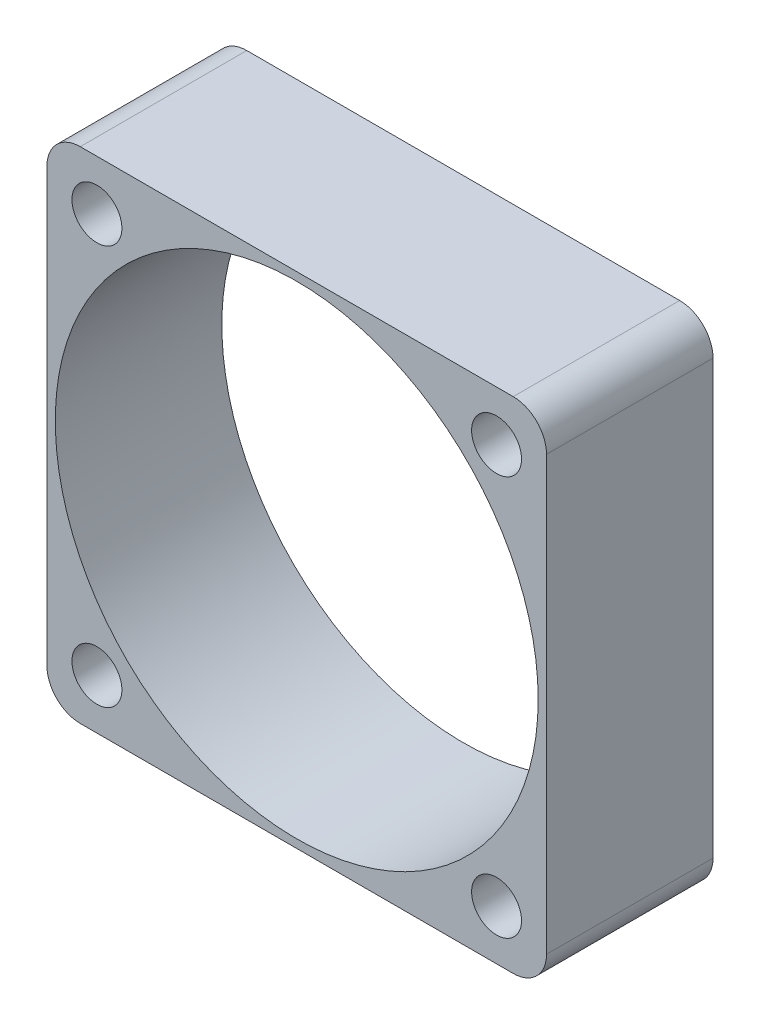
ISO-10303-21;
HEADER;
FILE_DESCRIPTION(('STEP AP214'),'2;1');
FILE_NAME('part.step','',(''),(''),'','','');
FILE_SCHEMA(('AUTOMOTIVE_DESIGN { 1 0 10303 214 1 1 1 1 }'));
ENDSEC;
DATA;
#1=APPLICATION_CONTEXT('core data for automotive mechanical design processes');
#2=APPLICATION_PROTOCOL_DEFINITION('international standard','automotive_design',2000,#1);
#3=PRODUCT_CONTEXT('',#1,'mechanical');
#4=PRODUCT('Part','Part','',(#3));
#5=PRODUCT_RELATED_PRODUCT_CATEGORY('part','',(#4));
#6=PRODUCT_DEFINITION_FORMATION('','',#4);
#7=PRODUCT_DEFINITION_CONTEXT('part definition',#1,'design');
#8=PRODUCT_DEFINITION('design','',#6,#7);
#9=PRODUCT_DEFINITION_SHAPE('','',#8);
#10=(LENGTH_UNIT() NAMED_UNIT(*) SI_UNIT(.MILLI.,.METRE.));
#11=(NAMED_UNIT(*) PLANE_ANGLE_UNIT() SI_UNIT($,.RADIAN.));
#12=(NAMED_UNIT(*) SI_UNIT($,.STERADIAN.) SOLID_ANGLE_UNIT());
#13=UNCERTAINTY_MEASURE_WITH_UNIT(LENGTH_MEASURE(1.E-05),#10,'distance_accuracy_value','');
#14=(GEOMETRIC_REPRESENTATION_CONTEXT(3) GLOBAL_UNCERTAINTY_ASSIGNED_CONTEXT((#13)) GLOBAL_UNIT_ASSIGNED_CONTEXT((#10,
#11,#12)) REPRESENTATION_CONTEXT('',''));
#15=CARTESIAN_POINT('',(0.,0.,0.));
#16=DIRECTION('',(0.,0.,1.));
#17=DIRECTION('',(1.,0.,0.));
#18=AXIS2_PLACEMENT_3D('',#15,#16,#17);
#19=CARTESIAN_POINT('',(0.,0.,10.));
#20=DIRECTION('',(0.,0.,1.));
#21=DIRECTION('',(1.,0.,0.));
#22=AXIS2_PLACEMENT_3D('',#19,#20,#21);
#23=PLANE('',#22);
#24=CARTESIAN_POINT('',(12.,12.,10.));
#25=DIRECTION('',(0.,0.,1.));
#26=DIRECTION('',(-1.,0.,0.));
#27=AXIS2_PLACEMENT_3D('',#24,#25,#26);
#28=CIRCLE('',#27,1.5);
#29=CARTESIAN_POINT('',(10.5,12.,10.));
#30=VERTEX_POINT('',#29);
#31=EDGE_CURVE('E200',#30,#30,#28,.T.);
#32=ORIENTED_EDGE('',*,*,#31,.F.);
#33=EDGE_LOOP('',(#32));
#34=FACE_BOUND('',#33,.T.);
#35=CARTESIAN_POINT('',(12.,-12.,10.));
#36=DIRECTION('',(0.,0.,1.));
#37=DIRECTION('',(1.,0.,0.));
#38=AXIS2_PLACEMENT_3D('',#35,#36,#37);
#39=CIRCLE('',#38,1.5);
#40=CARTESIAN_POINT('',(13.5,-12.,10.));
#41=VERTEX_POINT('',#40);
#42=EDGE_CURVE('E194',#41,#41,#39,.T.);
#43=ORIENTED_EDGE('',*,*,#42,.F.);
#44=EDGE_LOOP('',(#43));
#45=FACE_BOUND('',#44,.T.);
#46=CARTESIAN_POINT('',(-12.,-12.,10.));
#47=DIRECTION('',(0.,0.,1.));
#48=DIRECTION('',(-1.,0.,0.));
#49=AXIS2_PLACEMENT_3D('',#46,#47,#48);
#50=CIRCLE('',#49,1.5);
#51=CARTESIAN_POINT('',(-13.5,-12.,10.));
#52=VERTEX_POINT('',#51);
#53=EDGE_CURVE('E188',#52,#52,#50,.T.);
#54=ORIENTED_EDGE('',*,*,#53,.F.);
#55=EDGE_LOOP('',(#54));
#56=FACE_BOUND('',#55,.T.);
#57=CARTESIAN_POINT('',(-12.,12.,10.));
#58=DIRECTION('',(0.,0.,1.));
#59=DIRECTION('',(1.,0.,0.));
#60=AXIS2_PLACEMENT_3D('',#57,#58,#59);
#61=CIRCLE('',#60,1.5);
#62=CARTESIAN_POINT('',(-10.5,12.,10.));
#63=VERTEX_POINT('',#62);
#64=EDGE_CURVE('E182',#63,#63,#61,.T.);
#65=ORIENTED_EDGE('',*,*,#64,.F.);
#66=EDGE_LOOP('',(#65));
#67=FACE_BOUND('',#66,.T.);
#68=DIRECTION('',(0.,-1.,0.));
#69=VECTOR('',#68,1.);
#70=CARTESIAN_POINT('',(-15.,15.,10.));
#71=LINE('',#70,#69);
#72=CARTESIAN_POINT('',(-15.,13.,10.));
#73=VERTEX_POINT('',#72);
#74=CARTESIAN_POINT('',(-15.,-13.,10.));
#75=VERTEX_POINT('',#74);
#76=EDGE_CURVE('E136',#73,#75,#71,.T.);
#77=ORIENTED_EDGE('',*,*,#76,.T.);
#78=CARTESIAN_POINT('',(-13.,-13.,10.));
#79=DIRECTION('',(0.,0.,1.));
#80=DIRECTION('',(1.,0.,0.));
#81=AXIS2_PLACEMENT_3D('',#78,#79,#80);
#82=CIRCLE('',#81,2.);
#83=CARTESIAN_POINT('',(-13.,-15.,10.));
#84=VERTEX_POINT('',#83);
#85=EDGE_CURVE('E151',#75,#84,#82,.T.);
#86=ORIENTED_EDGE('',*,*,#85,.T.);
#87=DIRECTION('',(1.,0.,0.));
#88=VECTOR('',#87,1.);
#89=CARTESIAN_POINT('',(-15.,-15.,10.));
#90=LINE('',#89,#88);
#91=CARTESIAN_POINT('',(13.,-15.,10.));
#92=VERTEX_POINT('',#91);
#93=EDGE_CURVE('E118',#84,#92,#90,.T.);
#94=ORIENTED_EDGE('',*,*,#93,.T.);
#95=CARTESIAN_POINT('',(13.,-13.,10.));
#96=DIRECTION('',(0.,0.,1.));
#97=DIRECTION('',(1.,0.,0.));
#98=AXIS2_PLACEMENT_3D('',#95,#96,#97);
#99=CIRCLE('',#98,2.);
#100=CARTESIAN_POINT('',(15.,-13.,10.));
#101=VERTEX_POINT('',#100);
#102=EDGE_CURVE('E149',#92,#101,#99,.T.);
#103=ORIENTED_EDGE('',*,*,#102,.T.);
#104=DIRECTION('',(0.,1.,0.));
#105=VECTOR('',#104,1.);
#106=CARTESIAN_POINT('',(15.,15.,10.));
#107=LINE('',#106,#105);
#108=CARTESIAN_POINT('',(15.,13.,10.));
#109=VERTEX_POINT('',#108);
#110=EDGE_CURVE('E162',#101,#109,#107,.T.);
#111=ORIENTED_EDGE('',*,*,#110,.T.);
#112=CARTESIAN_POINT('',(13.,13.,10.));
#113=DIRECTION('',(0.,0.,1.));
#114=DIRECTION('',(1.,0.,0.));
#115=AXIS2_PLACEMENT_3D('',#112,#113,#114);
#116=CIRCLE('',#115,2.);
#117=CARTESIAN_POINT('',(13.,15.,10.));
#118=VERTEX_POINT('',#117);
#119=EDGE_CURVE('E53',#109,#118,#116,.T.);
#120=ORIENTED_EDGE('',*,*,#119,.T.);
#121=DIRECTION('',(-1.,0.,0.));
#122=VECTOR('',#121,1.);
#123=CARTESIAN_POINT('',(-15.,15.,10.));
#124=LINE('',#123,#122);
#125=CARTESIAN_POINT('',(-13.,15.,10.));
#126=VERTEX_POINT('',#125);
#127=EDGE_CURVE('E137',#118,#126,#124,.T.);
#128=ORIENTED_EDGE('',*,*,#127,.T.);
#129=CARTESIAN_POINT('',(-13.,13.,10.));
#130=DIRECTION('',(0.,0.,1.));
#131=DIRECTION('',(1.,0.,0.));
#132=AXIS2_PLACEMENT_3D('',#129,#130,#131);
#133=CIRCLE('',#132,2.);
#134=EDGE_CURVE('E146',#126,#73,#133,.T.);
#135=ORIENTED_EDGE('',*,*,#134,.T.);
#136=EDGE_LOOP('',(#77,#86,#94,#103,#111,#120,#128,#135));
#137=FACE_BOUND('',#136,.T.);
#138=CARTESIAN_POINT('',(0.,0.,10.));
#139=DIRECTION('',(0.,0.,1.));
#140=DIRECTION('',(1.,0.,0.));
#141=AXIS2_PLACEMENT_3D('',#138,#139,#140);
#142=CIRCLE('',#141,14.5);
#143=CARTESIAN_POINT('',(14.5,0.,10.));
#144=VERTEX_POINT('',#143);
#145=EDGE_CURVE('E131',#144,#144,#142,.T.);
#146=ORIENTED_EDGE('',*,*,#145,.F.);
#147=EDGE_LOOP('',(#146));
#148=FACE_BOUND('',#147,.T.);
#149=ADVANCED_FACE('F32',(#34,#45,#56,#67,#137,#148),#23,.T.);
#150=CARTESIAN_POINT('',(0.,0.,0.));
#151=DIRECTION('',(0.,0.,1.));
#152=DIRECTION('',(1.,0.,0.));
#153=AXIS2_PLACEMENT_3D('',#150,#151,#152);
#154=PLANE('',#153);
#155=CARTESIAN_POINT('',(12.,12.,0.));
#156=DIRECTION('',(0.,0.,1.));
#157=DIRECTION('',(-1.,0.,0.));
#158=AXIS2_PLACEMENT_3D('',#155,#156,#157);
#159=CIRCLE('',#158,1.5);
#160=CARTESIAN_POINT('',(10.5,12.,0.));
#161=VERTEX_POINT('',#160);
#162=EDGE_CURVE('E185',#161,#161,#159,.T.);
#163=ORIENTED_EDGE('',*,*,#162,.T.);
#164=EDGE_LOOP('',(#163));
#165=FACE_BOUND('',#164,.T.);
#166=CARTESIAN_POINT('',(12.,-12.,0.));
#167=DIRECTION('',(0.,0.,1.));
#168=DIRECTION('',(1.,0.,0.));
#169=AXIS2_PLACEMENT_3D('',#166,#167,#168);
#170=CIRCLE('',#169,1.5);
#171=CARTESIAN_POINT('',(13.5,-12.,0.));
#172=VERTEX_POINT('',#171);
#173=EDGE_CURVE('E197',#172,#172,#170,.T.);
#174=ORIENTED_EDGE('',*,*,#173,.T.);
#175=EDGE_LOOP('',(#174));
#176=FACE_BOUND('',#175,.T.);
#177=CARTESIAN_POINT('',(-12.,-12.,0.));
#178=DIRECTION('',(0.,0.,1.));
#179=DIRECTION('',(-1.,0.,0.));
#180=AXIS2_PLACEMENT_3D('',#177,#178,#179);
#181=CIRCLE('',#180,1.5);
#182=CARTESIAN_POINT('',(-13.5,-12.,0.));
#183=VERTEX_POINT('',#182);
#184=EDGE_CURVE('E191',#183,#183,#181,.T.);
#185=ORIENTED_EDGE('',*,*,#184,.T.);
#186=EDGE_LOOP('',(#185));
#187=FACE_BOUND('',#186,.T.);
#188=CARTESIAN_POINT('',(-12.,12.,0.));
#189=DIRECTION('',(0.,0.,1.));
#190=DIRECTION('',(1.,0.,0.));
#191=AXIS2_PLACEMENT_3D('',#188,#189,#190);
#192=CIRCLE('',#191,1.5);
#193=CARTESIAN_POINT('',(-10.5,12.,0.));
#194=VERTEX_POINT('',#193);
#195=EDGE_CURVE('E179',#194,#194,#192,.T.);
#196=ORIENTED_EDGE('',*,*,#195,.T.);
#197=EDGE_LOOP('',(#196));
#198=FACE_BOUND('',#197,.T.);
#199=DIRECTION('',(1.,0.,0.));
#200=VECTOR('',#199,1.);
#201=CARTESIAN_POINT('',(-15.,-15.,0.));
#202=LINE('',#201,#200);
#203=CARTESIAN_POINT('',(-13.,-15.,0.));
#204=VERTEX_POINT('',#203);
#205=CARTESIAN_POINT('',(13.,-15.,0.));
#206=VERTEX_POINT('',#205);
#207=EDGE_CURVE('E115',#204,#206,#202,.T.);
#208=ORIENTED_EDGE('',*,*,#207,.F.);
#209=CARTESIAN_POINT('',(-13.,-13.,0.));
#210=DIRECTION('',(0.,0.,1.));
#211=DIRECTION('',(1.,0.,0.));
#212=AXIS2_PLACEMENT_3D('',#209,#210,#211);
#213=CIRCLE('',#212,2.);
#214=CARTESIAN_POINT('',(-15.,-13.,0.));
#215=VERTEX_POINT('',#214);
#216=EDGE_CURVE('E98',#204,#215,#213,.F.);
#217=ORIENTED_EDGE('',*,*,#216,.T.);
#218=DIRECTION('',(0.,-1.,0.));
#219=VECTOR('',#218,1.);
#220=CARTESIAN_POINT('',(-15.,15.,0.));
#221=LINE('',#220,#219);
#222=CARTESIAN_POINT('',(-15.,13.,0.));
#223=VERTEX_POINT('',#222);
#224=EDGE_CURVE('E126',#223,#215,#221,.T.);
#225=ORIENTED_EDGE('',*,*,#224,.F.);
#226=CARTESIAN_POINT('',(-13.,13.,0.));
#227=DIRECTION('',(0.,0.,1.));
#228=DIRECTION('',(1.,0.,0.));
#229=AXIS2_PLACEMENT_3D('',#226,#227,#228);
#230=CIRCLE('',#229,2.);
#231=CARTESIAN_POINT('',(-13.,15.,0.));
#232=VERTEX_POINT('',#231);
#233=EDGE_CURVE('E119',#223,#232,#230,.F.);
#234=ORIENTED_EDGE('',*,*,#233,.T.);
#235=DIRECTION('',(-1.,0.,0.));
#236=VECTOR('',#235,1.);
#237=CARTESIAN_POINT('',(-15.,15.,0.));
#238=LINE('',#237,#236);
#239=CARTESIAN_POINT('',(13.,15.,0.));
#240=VERTEX_POINT('',#239);
#241=EDGE_CURVE('E129',#240,#232,#238,.T.);
#242=ORIENTED_EDGE('',*,*,#241,.F.);
#243=CARTESIAN_POINT('',(13.,13.,0.));
#244=DIRECTION('',(0.,0.,1.));
#245=DIRECTION('',(1.,0.,0.));
#246=AXIS2_PLACEMENT_3D('',#243,#244,#245);
#247=CIRCLE('',#246,2.);
#248=CARTESIAN_POINT('',(15.,13.,0.));
#249=VERTEX_POINT('',#248);
#250=EDGE_CURVE('E140',#240,#249,#247,.F.);
#251=ORIENTED_EDGE('',*,*,#250,.T.);
#252=DIRECTION('',(0.,1.,0.));
#253=VECTOR('',#252,1.);
#254=CARTESIAN_POINT('',(15.,15.,0.));
#255=LINE('',#254,#253);
#256=CARTESIAN_POINT('',(15.,-13.,0.));
#257=VERTEX_POINT('',#256);
#258=EDGE_CURVE('E125',#257,#249,#255,.T.);
#259=ORIENTED_EDGE('',*,*,#258,.F.);
#260=CARTESIAN_POINT('',(13.,-13.,0.));
#261=DIRECTION('',(0.,0.,1.));
#262=DIRECTION('',(1.,0.,0.));
#263=AXIS2_PLACEMENT_3D('',#260,#261,#262);
#264=CIRCLE('',#263,2.);
#265=EDGE_CURVE('E109',#257,#206,#264,.F.);
#266=ORIENTED_EDGE('',*,*,#265,.T.);
#267=EDGE_LOOP('',(#208,#217,#225,#234,#242,#251,#259,#266));
#268=FACE_BOUND('',#267,.T.);
#269=CARTESIAN_POINT('',(0.,0.,0.));
#270=DIRECTION('',(0.,0.,1.));
#271=DIRECTION('',(1.,0.,0.));
#272=AXIS2_PLACEMENT_3D('',#269,#270,#271);
#273=CIRCLE('',#272,14.5);
#274=CARTESIAN_POINT('',(14.5,0.,0.));
#275=VERTEX_POINT('',#274);
#276=EDGE_CURVE('E176',#275,#275,#273,.T.);
#277=ORIENTED_EDGE('',*,*,#276,.T.);
#278=EDGE_LOOP('',(#277));
#279=FACE_BOUND('',#278,.T.);
#280=ADVANCED_FACE('F122',(#165,#176,#187,#198,#268,#279),#154,.F.);
#281=CARTESIAN_POINT('',(-15.,15.,10.));
#282=DIRECTION('',(1.,0.,0.));
#283=DIRECTION('',(0.,1.,0.));
#284=AXIS2_PLACEMENT_3D('',#281,#282,#283);
#285=PLANE('',#284);
#286=ORIENTED_EDGE('',*,*,#224,.T.);
#287=DIRECTION('',(0.,0.,-1.));
#288=VECTOR('',#287,1.);
#289=CARTESIAN_POINT('',(-15.,-13.,10.));
#290=LINE('',#289,#288);
#291=EDGE_CURVE('E103',#215,#75,#290,.F.);
#292=ORIENTED_EDGE('',*,*,#291,.T.);
#293=ORIENTED_EDGE('',*,*,#76,.F.);
#294=DIRECTION('',(0.,0.,-1.));
#295=VECTOR('',#294,1.);
#296=CARTESIAN_POINT('',(-15.,13.,10.));
#297=LINE('',#296,#295);
#298=EDGE_CURVE('E108',#73,#223,#297,.T.);
#299=ORIENTED_EDGE('',*,*,#298,.T.);
#300=EDGE_LOOP('',(#286,#292,#293,#299));
#301=FACE_BOUND('',#300,.T.);
#302=ADVANCED_FACE('F233',(#301),#285,.F.);
#303=CARTESIAN_POINT('',(-15.,-15.,10.));
#304=DIRECTION('',(0.,1.,0.));
#305=DIRECTION('',(-1.,0.,0.));
#306=AXIS2_PLACEMENT_3D('',#303,#304,#305);
#307=PLANE('',#306);
#308=ORIENTED_EDGE('',*,*,#93,.F.);
#309=DIRECTION('',(0.,0.,-1.));
#310=VECTOR('',#309,1.);
#311=CARTESIAN_POINT('',(-13.,-15.,10.));
#312=LINE('',#311,#310);
#313=EDGE_CURVE('E102',#84,#204,#312,.T.);
#314=ORIENTED_EDGE('',*,*,#313,.T.);
#315=ORIENTED_EDGE('',*,*,#207,.T.);
#316=DIRECTION('',(0.,0.,-1.));
#317=VECTOR('',#316,1.);
#318=CARTESIAN_POINT('',(13.,-15.,10.));
#319=LINE('',#318,#317);
#320=EDGE_CURVE('E120',#206,#92,#319,.F.);
#321=ORIENTED_EDGE('',*,*,#320,.T.);
#322=EDGE_LOOP('',(#308,#314,#315,#321));
#323=FACE_BOUND('',#322,.T.);
#324=ADVANCED_FACE('F114',(#323),#307,.F.);
#325=CARTESIAN_POINT('',(15.,15.,10.));
#326=DIRECTION('',(-1.,0.,0.));
#327=DIRECTION('',(0.,0.,1.));
#328=AXIS2_PLACEMENT_3D('',#325,#326,#327);
#329=PLANE('',#328);
#330=ORIENTED_EDGE('',*,*,#110,.F.);
#331=DIRECTION('',(0.,0.,-1.));
#332=VECTOR('',#331,1.);
#333=CARTESIAN_POINT('',(15.,-13.,10.));
#334=LINE('',#333,#332);
#335=EDGE_CURVE('E155',#101,#257,#334,.T.);
#336=ORIENTED_EDGE('',*,*,#335,.T.);
#337=ORIENTED_EDGE('',*,*,#258,.T.);
#338=DIRECTION('',(0.,0.,-1.));
#339=VECTOR('',#338,1.);
#340=CARTESIAN_POINT('',(15.,13.,10.));
#341=LINE('',#340,#339);
#342=EDGE_CURVE('E153',#249,#109,#341,.F.);
#343=ORIENTED_EDGE('',*,*,#342,.T.);
#344=EDGE_LOOP('',(#330,#336,#337,#343));
#345=FACE_BOUND('',#344,.T.);
#346=ADVANCED_FACE('F160',(#345),#329,.F.);
#347=CARTESIAN_POINT('',(-15.,15.,10.));
#348=DIRECTION('',(0.,-1.,0.));
#349=DIRECTION('',(0.,0.,-1.));
#350=AXIS2_PLACEMENT_3D('',#347,#348,#349);
#351=PLANE('',#350);
#352=ORIENTED_EDGE('',*,*,#127,.F.);
#353=DIRECTION('',(0.,0.,-1.));
#354=VECTOR('',#353,1.);
#355=CARTESIAN_POINT('',(13.,15.,10.));
#356=LINE('',#355,#354);
#357=EDGE_CURVE('E11',#118,#240,#356,.T.);
#358=ORIENTED_EDGE('',*,*,#357,.T.);
#359=ORIENTED_EDGE('',*,*,#241,.T.);
#360=DIRECTION('',(0.,0.,-1.));
#361=VECTOR('',#360,1.);
#362=CARTESIAN_POINT('',(-13.,15.,10.));
#363=LINE('',#362,#361);
#364=EDGE_CURVE('E40',#232,#126,#363,.F.);
#365=ORIENTED_EDGE('',*,*,#364,.T.);
#366=EDGE_LOOP('',(#352,#358,#359,#365));
#367=FACE_BOUND('',#366,.T.);
#368=ADVANCED_FACE('F169',(#367),#351,.F.);
#369=CARTESIAN_POINT('',(0.,0.,10.));
#370=DIRECTION('',(0.,0.,-1.));
#371=DIRECTION('',(-1.,0.,0.));
#372=AXIS2_PLACEMENT_3D('',#369,#370,#371);
#373=CYLINDRICAL_SURFACE('',#372,14.5);
#374=ORIENTED_EDGE('',*,*,#145,.T.);
#375=EDGE_LOOP('',(#374));
#376=FACE_BOUND('',#375,.T.);
#377=ORIENTED_EDGE('',*,*,#276,.F.);
#378=EDGE_LOOP('',(#377));
#379=FACE_BOUND('',#378,.T.);
#380=ADVANCED_FACE('F227',(#376,#379),#373,.F.);
#381=CARTESIAN_POINT('',(-13.,-13.,10.));
#382=DIRECTION('',(0.,0.,-1.));
#383=DIRECTION('',(-1.,0.,0.));
#384=AXIS2_PLACEMENT_3D('',#381,#382,#383);
#385=CYLINDRICAL_SURFACE('',#384,2.);
#386=ORIENTED_EDGE('',*,*,#85,.F.);
#387=ORIENTED_EDGE('',*,*,#291,.F.);
#388=ORIENTED_EDGE('',*,*,#216,.F.);
#389=ORIENTED_EDGE('',*,*,#313,.F.);
#390=EDGE_LOOP('',(#386,#387,#388,#389));
#391=FACE_BOUND('',#390,.T.);
#392=ADVANCED_FACE('F101',(#391),#385,.T.);
#393=CARTESIAN_POINT('',(13.,-13.,10.));
#394=DIRECTION('',(0.,0.,-1.));
#395=DIRECTION('',(-1.,0.,0.));
#396=AXIS2_PLACEMENT_3D('',#393,#394,#395);
#397=CYLINDRICAL_SURFACE('',#396,2.);
#398=ORIENTED_EDGE('',*,*,#102,.F.);
#399=ORIENTED_EDGE('',*,*,#320,.F.);
#400=ORIENTED_EDGE('',*,*,#265,.F.);
#401=ORIENTED_EDGE('',*,*,#335,.F.);
#402=EDGE_LOOP('',(#398,#399,#400,#401));
#403=FACE_BOUND('',#402,.T.);
#404=ADVANCED_FACE('F250',(#403),#397,.T.);
#405=CARTESIAN_POINT('',(13.,13.,10.));
#406=DIRECTION('',(0.,0.,-1.));
#407=DIRECTION('',(-1.,0.,0.));
#408=AXIS2_PLACEMENT_3D('',#405,#406,#407);
#409=CYLINDRICAL_SURFACE('',#408,2.);
#410=ORIENTED_EDGE('',*,*,#119,.F.);
#411=ORIENTED_EDGE('',*,*,#342,.F.);
#412=ORIENTED_EDGE('',*,*,#250,.F.);
#413=ORIENTED_EDGE('',*,*,#357,.F.);
#414=EDGE_LOOP('',(#410,#411,#412,#413));
#415=FACE_BOUND('',#414,.T.);
#416=ADVANCED_FACE('F168',(#415),#409,.T.);
#417=CARTESIAN_POINT('',(-13.,13.,10.));
#418=DIRECTION('',(0.,0.,-1.));
#419=DIRECTION('',(-1.,0.,0.));
#420=AXIS2_PLACEMENT_3D('',#417,#418,#419);
#421=CYLINDRICAL_SURFACE('',#420,2.);
#422=ORIENTED_EDGE('',*,*,#134,.F.);
#423=ORIENTED_EDGE('',*,*,#364,.F.);
#424=ORIENTED_EDGE('',*,*,#233,.F.);
#425=ORIENTED_EDGE('',*,*,#298,.F.);
#426=EDGE_LOOP('',(#422,#423,#424,#425));
#427=FACE_BOUND('',#426,.T.);
#428=ADVANCED_FACE('F34',(#427),#421,.T.);
#429=CARTESIAN_POINT('',(-12.,12.,0.));
#430=DIRECTION('',(0.,0.,1.));
#431=DIRECTION('',(1.,0.,0.));
#432=AXIS2_PLACEMENT_3D('',#429,#430,#431);
#433=CYLINDRICAL_SURFACE('',#432,1.5);
#434=ORIENTED_EDGE('',*,*,#195,.F.);
#435=EDGE_LOOP('',(#434));
#436=FACE_BOUND('',#435,.T.);
#437=ORIENTED_EDGE('',*,*,#64,.T.);
#438=EDGE_LOOP('',(#437));
#439=FACE_BOUND('',#438,.T.);
#440=ADVANCED_FACE('F256',(#436,#439),#433,.F.);
#441=CARTESIAN_POINT('',(-12.,-12.,0.));
#442=DIRECTION('',(0.,0.,1.));
#443=DIRECTION('',(1.,0.,0.));
#444=AXIS2_PLACEMENT_3D('',#441,#442,#443);
#445=CYLINDRICAL_SURFACE('',#444,1.5);
#446=ORIENTED_EDGE('',*,*,#184,.F.);
#447=EDGE_LOOP('',(#446));
#448=FACE_BOUND('',#447,.T.);
#449=ORIENTED_EDGE('',*,*,#53,.T.);
#450=EDGE_LOOP('',(#449));
#451=FACE_BOUND('',#450,.T.);
#452=ADVANCED_FACE('F261',(#448,#451),#445,.F.);
#453=CARTESIAN_POINT('',(12.,-12.,0.));
#454=DIRECTION('',(0.,0.,1.));
#455=DIRECTION('',(1.,0.,0.));
#456=AXIS2_PLACEMENT_3D('',#453,#454,#455);
#457=CYLINDRICAL_SURFACE('',#456,1.5);
#458=ORIENTED_EDGE('',*,*,#173,.F.);
#459=EDGE_LOOP('',(#458));
#460=FACE_BOUND('',#459,.T.);
#461=ORIENTED_EDGE('',*,*,#42,.T.);
#462=EDGE_LOOP('',(#461));
#463=FACE_BOUND('',#462,.T.);
#464=ADVANCED_FACE('F211',(#460,#463),#457,.F.);
#465=CARTESIAN_POINT('',(12.,12.,0.));
#466=DIRECTION('',(0.,0.,1.));
#467=DIRECTION('',(1.,0.,0.));
#468=AXIS2_PLACEMENT_3D('',#465,#466,#467);
#469=CYLINDRICAL_SURFACE('',#468,1.5);
#470=ORIENTED_EDGE('',*,*,#162,.F.);
#471=EDGE_LOOP('',(#470));
#472=FACE_BOUND('',#471,.T.);
#473=ORIENTED_EDGE('',*,*,#31,.T.);
#474=EDGE_LOOP('',(#473));
#475=FACE_BOUND('',#474,.T.);
#476=ADVANCED_FACE('F208',(#472,#475),#469,.F.);
#477=CLOSED_SHELL('',(#149,#280,#302,#324,#346,#368,#380,#392,#404,#416,#428,#440,#452,#464,#476));
#478=MANIFOLD_SOLID_BREP('B2',#477);
#479=ADVANCED_BREP_SHAPE_REPRESENTATION('',(#18,#478),#14);
#480=SHAPE_DEFINITION_REPRESENTATION(#9,#479);
ENDSEC;
END-ISO-10303-21;
